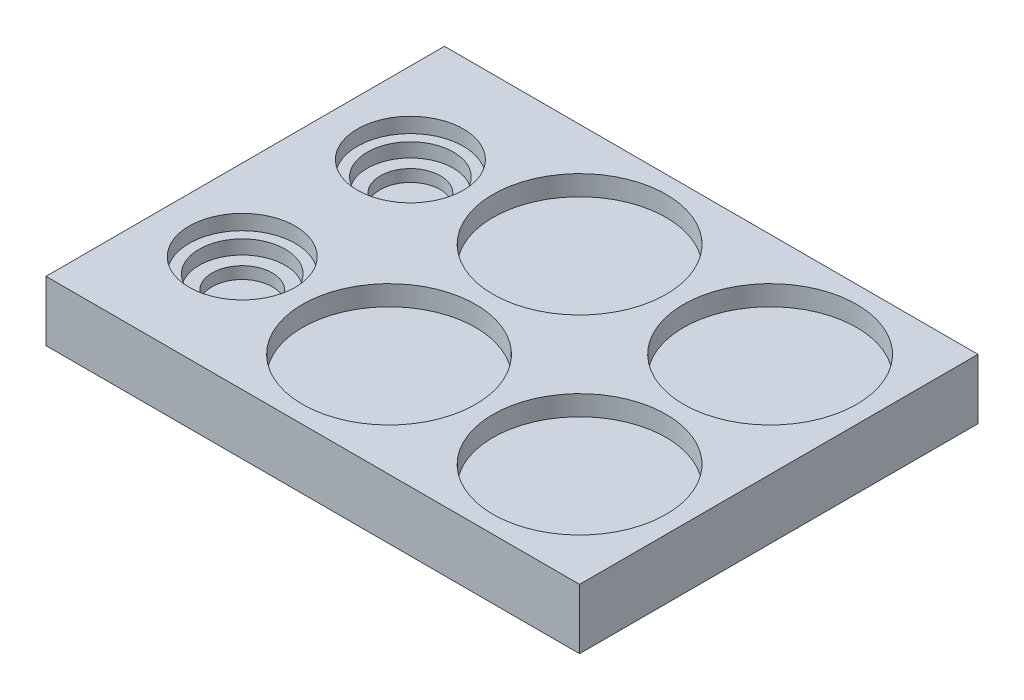
ISO-10303-21;
HEADER;
FILE_DESCRIPTION(('STEP AP214'),'2;1');
FILE_NAME('part.step','',(''),(''),'','','');
FILE_SCHEMA(('AUTOMOTIVE_DESIGN { 1 0 10303 214 1 1 1 1 }'));
ENDSEC;
DATA;
#1=APPLICATION_CONTEXT('core data for automotive mechanical design processes');
#2=APPLICATION_PROTOCOL_DEFINITION('international standard','automotive_design',2000,#1);
#3=PRODUCT_CONTEXT('',#1,'mechanical');
#4=PRODUCT('Part','Part','',(#3));
#5=PRODUCT_RELATED_PRODUCT_CATEGORY('part','',(#4));
#6=PRODUCT_DEFINITION_FORMATION('','',#4);
#7=PRODUCT_DEFINITION_CONTEXT('part definition',#1,'design');
#8=PRODUCT_DEFINITION('design','',#6,#7);
#9=PRODUCT_DEFINITION_SHAPE('','',#8);
#10=(LENGTH_UNIT() NAMED_UNIT(*) SI_UNIT(.MILLI.,.METRE.));
#11=(NAMED_UNIT(*) PLANE_ANGLE_UNIT() SI_UNIT($,.RADIAN.));
#12=(NAMED_UNIT(*) SI_UNIT($,.STERADIAN.) SOLID_ANGLE_UNIT());
#13=UNCERTAINTY_MEASURE_WITH_UNIT(LENGTH_MEASURE(1.E-05),#10,'distance_accuracy_value','');
#14=(GEOMETRIC_REPRESENTATION_CONTEXT(3) GLOBAL_UNCERTAINTY_ASSIGNED_CONTEXT((#13)) GLOBAL_UNIT_ASSIGNED_CONTEXT((#10,
#11,#12)) REPRESENTATION_CONTEXT('',''));
#15=CARTESIAN_POINT('',(0.,0.,0.));
#16=DIRECTION('',(0.,0.,1.));
#17=DIRECTION('',(1.,0.,0.));
#18=AXIS2_PLACEMENT_3D('',#15,#16,#17);
#19=CARTESIAN_POINT('',(0.,-60.,-398.));
#20=DIRECTION('',(-1.,0.,0.));
#21=DIRECTION('',(0.,0.,1.));
#22=AXIS2_PLACEMENT_3D('',#19,#20,#21);
#23=PLANE('',#22);
#24=DIRECTION('',(0.,0.,1.));
#25=VECTOR('',#24,1.);
#26=CARTESIAN_POINT('',(0.,0.,-398.));
#27=LINE('',#26,#25);
#28=CARTESIAN_POINT('',(0.,0.,-398.));
#29=VERTEX_POINT('',#28);
#30=CARTESIAN_POINT('',(0.,0.,0.));
#31=VERTEX_POINT('',#30);
#32=EDGE_CURVE('E100',#29,#31,#27,.T.);
#33=ORIENTED_EDGE('',*,*,#32,.F.);
#34=DIRECTION('',(0.,1.,0.));
#35=VECTOR('',#34,1.);
#36=CARTESIAN_POINT('',(0.,-60.,-398.));
#37=LINE('',#36,#35);
#38=CARTESIAN_POINT('',(0.,-60.,-398.));
#39=VERTEX_POINT('',#38);
#40=EDGE_CURVE('E11',#39,#29,#37,.T.);
#41=ORIENTED_EDGE('',*,*,#40,.F.);
#42=DIRECTION('',(0.,0.,1.));
#43=VECTOR('',#42,1.);
#44=CARTESIAN_POINT('',(0.,-60.,-398.));
#45=LINE('',#44,#43);
#46=CARTESIAN_POINT('',(0.,-60.,0.));
#47=VERTEX_POINT('',#46);
#48=EDGE_CURVE('E93',#39,#47,#45,.T.);
#49=ORIENTED_EDGE('',*,*,#48,.T.);
#50=DIRECTION('',(0.,1.,0.));
#51=VECTOR('',#50,1.);
#52=CARTESIAN_POINT('',(0.,-60.,0.));
#53=LINE('',#52,#51);
#54=EDGE_CURVE('E38',#47,#31,#53,.T.);
#55=ORIENTED_EDGE('',*,*,#54,.T.);
#56=EDGE_LOOP('',(#33,#41,#49,#55));
#57=FACE_BOUND('',#56,.T.);
#58=ADVANCED_FACE('F35',(#57),#23,.T.);
#59=CARTESIAN_POINT('',(0.,-60.,-398.));
#60=DIRECTION('',(0.,0.,-1.));
#61=DIRECTION('',(-1.,0.,0.));
#62=AXIS2_PLACEMENT_3D('',#59,#60,#61);
#63=PLANE('',#62);
#64=DIRECTION('',(-1.,0.,0.));
#65=VECTOR('',#64,1.);
#66=CARTESIAN_POINT('',(0.,0.,-398.));
#67=LINE('',#66,#65);
#68=CARTESIAN_POINT('',(533.,0.,-398.));
#69=VERTEX_POINT('',#68);
#70=EDGE_CURVE('E95',#69,#29,#67,.T.);
#71=ORIENTED_EDGE('',*,*,#70,.F.);
#72=DIRECTION('',(0.,1.,0.));
#73=VECTOR('',#72,1.);
#74=CARTESIAN_POINT('',(533.,-60.,-398.));
#75=LINE('',#74,#73);
#76=CARTESIAN_POINT('',(533.,-60.,-398.));
#77=VERTEX_POINT('',#76);
#78=EDGE_CURVE('E44',#77,#69,#75,.T.);
#79=ORIENTED_EDGE('',*,*,#78,.F.);
#80=DIRECTION('',(-1.,0.,0.));
#81=VECTOR('',#80,1.);
#82=CARTESIAN_POINT('',(0.,-60.,-398.));
#83=LINE('',#82,#81);
#84=EDGE_CURVE('E90',#77,#39,#83,.T.);
#85=ORIENTED_EDGE('',*,*,#84,.T.);
#86=ORIENTED_EDGE('',*,*,#40,.T.);
#87=EDGE_LOOP('',(#71,#79,#85,#86));
#88=FACE_BOUND('',#87,.T.);
#89=ADVANCED_FACE('F111',(#88),#63,.T.);
#90=CARTESIAN_POINT('',(533.,-60.,-398.));
#91=DIRECTION('',(1.,0.,0.));
#92=DIRECTION('',(0.,0.,-1.));
#93=AXIS2_PLACEMENT_3D('',#90,#91,#92);
#94=PLANE('',#93);
#95=DIRECTION('',(0.,0.,-1.));
#96=VECTOR('',#95,1.);
#97=CARTESIAN_POINT('',(533.,0.,-398.));
#98=LINE('',#97,#96);
#99=CARTESIAN_POINT('',(533.,0.,-2.22044604925031E-13));
#100=VERTEX_POINT('',#99);
#101=EDGE_CURVE('E85',#100,#69,#98,.T.);
#102=ORIENTED_EDGE('',*,*,#101,.F.);
#103=DIRECTION('',(0.,1.,0.));
#104=VECTOR('',#103,1.);
#105=CARTESIAN_POINT('',(533.,-60.,-2.22044604925031E-13));
#106=LINE('',#105,#104);
#107=CARTESIAN_POINT('',(533.,-60.,-2.22044604925031E-13));
#108=VERTEX_POINT('',#107);
#109=EDGE_CURVE('E80',#108,#100,#106,.T.);
#110=ORIENTED_EDGE('',*,*,#109,.F.);
#111=DIRECTION('',(0.,0.,-1.));
#112=VECTOR('',#111,1.);
#113=CARTESIAN_POINT('',(533.,-60.,-398.));
#114=LINE('',#113,#112);
#115=EDGE_CURVE('E83',#108,#77,#114,.T.);
#116=ORIENTED_EDGE('',*,*,#115,.T.);
#117=ORIENTED_EDGE('',*,*,#78,.T.);
#118=EDGE_LOOP('',(#102,#110,#116,#117));
#119=FACE_BOUND('',#118,.T.);
#120=ADVANCED_FACE('F82',(#119),#94,.T.);
#121=CARTESIAN_POINT('',(0.,-60.,0.));
#122=DIRECTION('',(0.,0.,1.));
#123=DIRECTION('',(1.,0.,0.));
#124=AXIS2_PLACEMENT_3D('',#121,#122,#123);
#125=PLANE('',#124);
#126=DIRECTION('',(1.,0.,0.));
#127=VECTOR('',#126,1.);
#128=CARTESIAN_POINT('',(0.,0.,0.));
#129=LINE('',#128,#127);
#130=EDGE_CURVE('E103',#31,#100,#129,.T.);
#131=ORIENTED_EDGE('',*,*,#130,.F.);
#132=ORIENTED_EDGE('',*,*,#54,.F.);
#133=DIRECTION('',(1.,0.,0.));
#134=VECTOR('',#133,1.);
#135=CARTESIAN_POINT('',(0.,-60.,0.));
#136=LINE('',#135,#134);
#137=EDGE_CURVE('E89',#47,#108,#136,.T.);
#138=ORIENTED_EDGE('',*,*,#137,.T.);
#139=ORIENTED_EDGE('',*,*,#109,.T.);
#140=EDGE_LOOP('',(#131,#132,#138,#139));
#141=FACE_BOUND('',#140,.T.);
#142=ADVANCED_FACE('F92',(#141),#125,.T.);
#143=CARTESIAN_POINT('',(0.,-60.,0.));
#144=DIRECTION('',(0.,1.,0.));
#145=DIRECTION('',(0.,0.,1.));
#146=AXIS2_PLACEMENT_3D('',#143,#144,#145);
#147=PLANE('',#146);
#148=ORIENTED_EDGE('',*,*,#48,.F.);
#149=ORIENTED_EDGE('',*,*,#84,.F.);
#150=ORIENTED_EDGE('',*,*,#115,.F.);
#151=ORIENTED_EDGE('',*,*,#137,.F.);
#152=EDGE_LOOP('',(#148,#149,#150,#151));
#153=FACE_BOUND('',#152,.T.);
#154=ADVANCED_FACE('F88',(#153),#147,.F.);
#155=CARTESIAN_POINT('',(0.,0.,0.));
#156=DIRECTION('',(0.,1.,0.));
#157=DIRECTION('',(0.,0.,1.));
#158=AXIS2_PLACEMENT_3D('',#155,#156,#157);
#159=PLANE('',#158);
#160=CARTESIAN_POINT('',(81.0000000000002,0.,-283.));
#161=DIRECTION('',(0.,1.,0.));
#162=DIRECTION('',(0.,0.,1.));
#163=AXIS2_PLACEMENT_3D('',#160,#161,#162);
#164=CIRCLE('',#163,53.);
#165=CARTESIAN_POINT('',(81.0000000000002,0.,-230.));
#166=VERTEX_POINT('',#165);
#167=EDGE_CURVE('E242',#166,#166,#164,.T.);
#168=ORIENTED_EDGE('',*,*,#167,.F.);
#169=EDGE_LOOP('',(#168));
#170=FACE_BOUND('',#169,.T.);
#171=CARTESIAN_POINT('',(81.0000000000019,0.,-115.));
#172=DIRECTION('',(0.,1.,0.));
#173=DIRECTION('',(0.,0.,1.));
#174=AXIS2_PLACEMENT_3D('',#171,#172,#173);
#175=CIRCLE('',#174,53.);
#176=CARTESIAN_POINT('',(81.0000000000019,0.,-62.));
#177=VERTEX_POINT('',#176);
#178=EDGE_CURVE('E232',#177,#177,#175,.T.);
#179=ORIENTED_EDGE('',*,*,#178,.F.);
#180=EDGE_LOOP('',(#179));
#181=FACE_BOUND('',#180,.T.);
#182=CARTESIAN_POINT('',(429.166666666666,0.,-294.166666666667));
#183=DIRECTION('',(0.,1.,0.));
#184=DIRECTION('',(0.,0.,1.));
#185=AXIS2_PLACEMENT_3D('',#182,#183,#184);
#186=CIRCLE('',#185,86.5);
#187=CARTESIAN_POINT('',(429.166666666666,0.,-207.666666666667));
#188=VERTEX_POINT('',#187);
#189=EDGE_CURVE('E241',#188,#188,#186,.T.);
#190=ORIENTED_EDGE('',*,*,#189,.F.);
#191=EDGE_LOOP('',(#190));
#192=FACE_BOUND('',#191,.T.);
#193=CARTESIAN_POINT('',(238.833333333333,0.,-294.166666666667));
#194=DIRECTION('',(0.,1.,0.));
#195=DIRECTION('',(0.,0.,1.));
#196=AXIS2_PLACEMENT_3D('',#193,#194,#195);
#197=CIRCLE('',#196,86.5);
#198=CARTESIAN_POINT('',(238.833333333333,0.,-207.666666666667));
#199=VERTEX_POINT('',#198);
#200=EDGE_CURVE('E260',#199,#199,#197,.T.);
#201=ORIENTED_EDGE('',*,*,#200,.F.);
#202=EDGE_LOOP('',(#201));
#203=FACE_BOUND('',#202,.T.);
#204=CARTESIAN_POINT('',(238.833333333333,0.,-103.833333333333));
#205=DIRECTION('',(0.,1.,0.));
#206=DIRECTION('',(0.,0.,1.));
#207=AXIS2_PLACEMENT_3D('',#204,#205,#206);
#208=CIRCLE('',#207,86.5);
#209=CARTESIAN_POINT('',(238.833333333333,0.,-17.3333333333334));
#210=VERTEX_POINT('',#209);
#211=EDGE_CURVE('E254',#210,#210,#208,.T.);
#212=ORIENTED_EDGE('',*,*,#211,.F.);
#213=EDGE_LOOP('',(#212));
#214=FACE_BOUND('',#213,.T.);
#215=CARTESIAN_POINT('',(429.166666666666,0.,-103.833333333333));
#216=DIRECTION('',(0.,1.,0.));
#217=DIRECTION('',(0.,0.,1.));
#218=AXIS2_PLACEMENT_3D('',#215,#216,#217);
#219=CIRCLE('',#218,86.5);
#220=CARTESIAN_POINT('',(429.166666666666,0.,-17.3333333333334));
#221=VERTEX_POINT('',#220);
#222=EDGE_CURVE('E253',#221,#221,#219,.T.);
#223=ORIENTED_EDGE('',*,*,#222,.F.);
#224=EDGE_LOOP('',(#223));
#225=FACE_BOUND('',#224,.T.);
#226=ORIENTED_EDGE('',*,*,#32,.T.);
#227=ORIENTED_EDGE('',*,*,#130,.T.);
#228=ORIENTED_EDGE('',*,*,#101,.T.);
#229=ORIENTED_EDGE('',*,*,#70,.T.);
#230=EDGE_LOOP('',(#226,#227,#228,#229));
#231=FACE_BOUND('',#230,.T.);
#232=ADVANCED_FACE('F110',(#170,#181,#192,#203,#214,#225,#231),#159,.T.);
#233=CARTESIAN_POINT('',(429.166666666666,-20.,-103.833333333333));
#234=DIRECTION('',(0.,1.,0.));
#235=DIRECTION('',(0.,0.,1.));
#236=AXIS2_PLACEMENT_3D('',#233,#234,#235);
#237=CYLINDRICAL_SURFACE('',#236,86.5);
#238=CARTESIAN_POINT('',(429.166666666666,-20.,-103.833333333333));
#239=DIRECTION('',(0.,1.,0.));
#240=DIRECTION('',(0.,0.,1.));
#241=AXIS2_PLACEMENT_3D('',#238,#239,#240);
#242=CIRCLE('',#241,86.5);
#243=CARTESIAN_POINT('',(429.166666666666,-20.,-17.3333333333334));
#244=VERTEX_POINT('',#243);
#245=EDGE_CURVE('E104',#244,#244,#242,.T.);
#246=ORIENTED_EDGE('',*,*,#245,.F.);
#247=EDGE_LOOP('',(#246));
#248=FACE_BOUND('',#247,.T.);
#249=ORIENTED_EDGE('',*,*,#222,.T.);
#250=EDGE_LOOP('',(#249));
#251=FACE_BOUND('',#250,.T.);
#252=ADVANCED_FACE('F128',(#248,#251),#237,.F.);
#253=CARTESIAN_POINT('',(429.166666666666,-20.,-103.833333333333));
#254=DIRECTION('',(0.,1.,0.));
#255=DIRECTION('',(0.,0.,1.));
#256=AXIS2_PLACEMENT_3D('',#253,#254,#255);
#257=PLANE('',#256);
#258=ORIENTED_EDGE('',*,*,#245,.T.);
#259=EDGE_LOOP('',(#258));
#260=FACE_BOUND('',#259,.T.);
#261=ADVANCED_FACE('F133',(#260),#257,.T.);
#262=CARTESIAN_POINT('',(238.833333333333,-20.,-103.833333333333));
#263=DIRECTION('',(0.,1.,0.));
#264=DIRECTION('',(0.,0.,1.));
#265=AXIS2_PLACEMENT_3D('',#262,#263,#264);
#266=CYLINDRICAL_SURFACE('',#265,86.5);
#267=CARTESIAN_POINT('',(238.833333333333,-20.,-103.833333333333));
#268=DIRECTION('',(0.,1.,0.));
#269=DIRECTION('',(0.,0.,1.));
#270=AXIS2_PLACEMENT_3D('',#267,#268,#269);
#271=CIRCLE('',#270,86.5);
#272=CARTESIAN_POINT('',(238.833333333333,-20.,-17.3333333333334));
#273=VERTEX_POINT('',#272);
#274=EDGE_CURVE('E250',#273,#273,#271,.T.);
#275=ORIENTED_EDGE('',*,*,#274,.F.);
#276=EDGE_LOOP('',(#275));
#277=FACE_BOUND('',#276,.T.);
#278=ORIENTED_EDGE('',*,*,#211,.T.);
#279=EDGE_LOOP('',(#278));
#280=FACE_BOUND('',#279,.T.);
#281=ADVANCED_FACE('F137',(#277,#280),#266,.F.);
#282=CARTESIAN_POINT('',(238.833333333333,-20.,-103.833333333333));
#283=DIRECTION('',(0.,1.,0.));
#284=DIRECTION('',(0.,0.,1.));
#285=AXIS2_PLACEMENT_3D('',#282,#283,#284);
#286=PLANE('',#285);
#287=ORIENTED_EDGE('',*,*,#274,.T.);
#288=EDGE_LOOP('',(#287));
#289=FACE_BOUND('',#288,.T.);
#290=ADVANCED_FACE('F152',(#289),#286,.T.);
#291=CARTESIAN_POINT('',(238.833333333333,-20.,-294.166666666667));
#292=DIRECTION('',(0.,1.,0.));
#293=DIRECTION('',(0.,0.,1.));
#294=AXIS2_PLACEMENT_3D('',#291,#292,#293);
#295=CYLINDRICAL_SURFACE('',#294,86.5);
#296=CARTESIAN_POINT('',(238.833333333333,-20.,-294.166666666667));
#297=DIRECTION('',(0.,1.,0.));
#298=DIRECTION('',(0.,0.,1.));
#299=AXIS2_PLACEMENT_3D('',#296,#297,#298);
#300=CIRCLE('',#299,86.5);
#301=CARTESIAN_POINT('',(238.833333333333,-20.,-207.666666666667));
#302=VERTEX_POINT('',#301);
#303=EDGE_CURVE('E257',#302,#302,#300,.T.);
#304=ORIENTED_EDGE('',*,*,#303,.F.);
#305=EDGE_LOOP('',(#304));
#306=FACE_BOUND('',#305,.T.);
#307=ORIENTED_EDGE('',*,*,#200,.T.);
#308=EDGE_LOOP('',(#307));
#309=FACE_BOUND('',#308,.T.);
#310=ADVANCED_FACE('F149',(#306,#309),#295,.F.);
#311=CARTESIAN_POINT('',(238.833333333333,-20.,-294.166666666667));
#312=DIRECTION('',(0.,1.,0.));
#313=DIRECTION('',(0.,0.,1.));
#314=AXIS2_PLACEMENT_3D('',#311,#312,#313);
#315=PLANE('',#314);
#316=ORIENTED_EDGE('',*,*,#303,.T.);
#317=EDGE_LOOP('',(#316));
#318=FACE_BOUND('',#317,.T.);
#319=ADVANCED_FACE('F143',(#318),#315,.T.);
#320=CARTESIAN_POINT('',(429.166666666666,-20.,-294.166666666667));
#321=DIRECTION('',(0.,1.,0.));
#322=DIRECTION('',(0.,0.,1.));
#323=AXIS2_PLACEMENT_3D('',#320,#321,#322);
#324=CYLINDRICAL_SURFACE('',#323,86.5);
#325=CARTESIAN_POINT('',(429.166666666666,-20.,-294.166666666667));
#326=DIRECTION('',(0.,1.,0.));
#327=DIRECTION('',(0.,0.,1.));
#328=AXIS2_PLACEMENT_3D('',#325,#326,#327);
#329=CIRCLE('',#328,86.5);
#330=CARTESIAN_POINT('',(429.166666666666,-20.,-207.666666666667));
#331=VERTEX_POINT('',#330);
#332=EDGE_CURVE('E263',#331,#331,#329,.T.);
#333=ORIENTED_EDGE('',*,*,#332,.F.);
#334=EDGE_LOOP('',(#333));
#335=FACE_BOUND('',#334,.T.);
#336=ORIENTED_EDGE('',*,*,#189,.T.);
#337=EDGE_LOOP('',(#336));
#338=FACE_BOUND('',#337,.T.);
#339=ADVANCED_FACE('F139',(#335,#338),#324,.F.);
#340=CARTESIAN_POINT('',(429.166666666666,-20.,-294.166666666667));
#341=DIRECTION('',(0.,1.,0.));
#342=DIRECTION('',(0.,0.,1.));
#343=AXIS2_PLACEMENT_3D('',#340,#341,#342);
#344=PLANE('',#343);
#345=ORIENTED_EDGE('',*,*,#332,.T.);
#346=EDGE_LOOP('',(#345));
#347=FACE_BOUND('',#346,.T.);
#348=ADVANCED_FACE('F142',(#347),#344,.T.);
#349=CARTESIAN_POINT('',(81.0000000000019,-15.,-115.));
#350=DIRECTION('',(0.,1.,0.));
#351=DIRECTION('',(0.,0.,1.));
#352=AXIS2_PLACEMENT_3D('',#349,#350,#351);
#353=CYLINDRICAL_SURFACE('',#352,53.);
#354=CARTESIAN_POINT('',(81.0000000000019,-15.,-115.));
#355=DIRECTION('',(0.,1.,0.));
#356=DIRECTION('',(0.,0.,1.));
#357=AXIS2_PLACEMENT_3D('',#354,#355,#356);
#358=CIRCLE('',#357,53.);
#359=CARTESIAN_POINT('',(81.0000000000019,-15.,-62.));
#360=VERTEX_POINT('',#359);
#361=EDGE_CURVE('E245',#360,#360,#358,.T.);
#362=ORIENTED_EDGE('',*,*,#361,.F.);
#363=EDGE_LOOP('',(#362));
#364=FACE_BOUND('',#363,.T.);
#365=ORIENTED_EDGE('',*,*,#178,.T.);
#366=EDGE_LOOP('',(#365));
#367=FACE_BOUND('',#366,.T.);
#368=ADVANCED_FACE('F147',(#364,#367),#353,.F.);
#369=CARTESIAN_POINT('',(81.0000000000019,-15.,-115.));
#370=DIRECTION('',(0.,1.,0.));
#371=DIRECTION('',(0.,0.,1.));
#372=AXIS2_PLACEMENT_3D('',#369,#370,#371);
#373=PLANE('',#372);
#374=CARTESIAN_POINT('',(81.0000000000019,-15.,-115.));
#375=DIRECTION('',(0.,1.,0.));
#376=DIRECTION('',(0.,0.,1.));
#377=AXIS2_PLACEMENT_3D('',#374,#375,#376);
#378=CIRCLE('',#377,43.);
#379=CARTESIAN_POINT('',(81.0000000000019,-15.,-72.0000000000001));
#380=VERTEX_POINT('',#379);
#381=EDGE_CURVE('E214',#380,#380,#378,.T.);
#382=ORIENTED_EDGE('',*,*,#381,.F.);
#383=EDGE_LOOP('',(#382));
#384=FACE_BOUND('',#383,.T.);
#385=ORIENTED_EDGE('',*,*,#361,.T.);
#386=EDGE_LOOP('',(#385));
#387=FACE_BOUND('',#386,.T.);
#388=ADVANCED_FACE('F165',(#384,#387),#373,.T.);
#389=CARTESIAN_POINT('',(81.0000000000002,-15.,-283.));
#390=DIRECTION('',(0.,1.,0.));
#391=DIRECTION('',(0.,0.,1.));
#392=AXIS2_PLACEMENT_3D('',#389,#390,#391);
#393=CYLINDRICAL_SURFACE('',#392,53.);
#394=CARTESIAN_POINT('',(81.0000000000002,-15.,-283.));
#395=DIRECTION('',(0.,1.,0.));
#396=DIRECTION('',(0.,0.,1.));
#397=AXIS2_PLACEMENT_3D('',#394,#395,#396);
#398=CIRCLE('',#397,53.);
#399=CARTESIAN_POINT('',(81.0000000000002,-15.,-230.));
#400=VERTEX_POINT('',#399);
#401=EDGE_CURVE('E238',#400,#400,#398,.T.);
#402=ORIENTED_EDGE('',*,*,#401,.F.);
#403=EDGE_LOOP('',(#402));
#404=FACE_BOUND('',#403,.T.);
#405=ORIENTED_EDGE('',*,*,#167,.T.);
#406=EDGE_LOOP('',(#405));
#407=FACE_BOUND('',#406,.T.);
#408=ADVANCED_FACE('F169',(#404,#407),#393,.F.);
#409=CARTESIAN_POINT('',(81.0000000000002,-15.,-283.));
#410=DIRECTION('',(0.,1.,0.));
#411=DIRECTION('',(0.,0.,1.));
#412=AXIS2_PLACEMENT_3D('',#409,#410,#411);
#413=PLANE('',#412);
#414=CARTESIAN_POINT('',(81.0000000000002,-15.,-283.));
#415=DIRECTION('',(0.,1.,0.));
#416=DIRECTION('',(0.,0.,1.));
#417=AXIS2_PLACEMENT_3D('',#414,#415,#416);
#418=CIRCLE('',#417,43.);
#419=CARTESIAN_POINT('',(81.0000000000002,-15.,-240.));
#420=VERTEX_POINT('',#419);
#421=EDGE_CURVE('E233',#420,#420,#418,.T.);
#422=ORIENTED_EDGE('',*,*,#421,.F.);
#423=EDGE_LOOP('',(#422));
#424=FACE_BOUND('',#423,.T.);
#425=ORIENTED_EDGE('',*,*,#401,.T.);
#426=EDGE_LOOP('',(#425));
#427=FACE_BOUND('',#426,.T.);
#428=ADVANCED_FACE('F173',(#424,#427),#413,.T.);
#429=CARTESIAN_POINT('',(81.0000000000002,-29.,-283.));
#430=DIRECTION('',(0.,1.,0.));
#431=DIRECTION('',(0.,0.,1.));
#432=AXIS2_PLACEMENT_3D('',#429,#430,#431);
#433=CYLINDRICAL_SURFACE('',#432,43.);
#434=CARTESIAN_POINT('',(81.0000000000002,-29.,-283.));
#435=DIRECTION('',(0.,1.,0.));
#436=DIRECTION('',(0.,0.,1.));
#437=AXIS2_PLACEMENT_3D('',#434,#435,#436);
#438=CIRCLE('',#437,43.);
#439=CARTESIAN_POINT('',(81.0000000000002,-29.,-240.));
#440=VERTEX_POINT('',#439);
#441=EDGE_CURVE('E229',#440,#440,#438,.T.);
#442=ORIENTED_EDGE('',*,*,#441,.F.);
#443=EDGE_LOOP('',(#442));
#444=FACE_BOUND('',#443,.T.);
#445=ORIENTED_EDGE('',*,*,#421,.T.);
#446=EDGE_LOOP('',(#445));
#447=FACE_BOUND('',#446,.T.);
#448=ADVANCED_FACE('F177',(#444,#447),#433,.F.);
#449=CARTESIAN_POINT('',(81.0000000000002,-29.,-283.));
#450=DIRECTION('',(0.,1.,0.));
#451=DIRECTION('',(0.,0.,1.));
#452=AXIS2_PLACEMENT_3D('',#449,#450,#451);
#453=PLANE('',#452);
#454=CARTESIAN_POINT('',(81.0000000000002,-29.,-283.));
#455=DIRECTION('',(0.,1.,0.));
#456=DIRECTION('',(0.,0.,1.));
#457=AXIS2_PLACEMENT_3D('',#454,#455,#456);
#458=CIRCLE('',#457,30.);
#459=CARTESIAN_POINT('',(81.0000000000002,-29.,-253.));
#460=VERTEX_POINT('',#459);
#461=EDGE_CURVE('E215',#460,#460,#458,.T.);
#462=ORIENTED_EDGE('',*,*,#461,.F.);
#463=EDGE_LOOP('',(#462));
#464=FACE_BOUND('',#463,.T.);
#465=ORIENTED_EDGE('',*,*,#441,.T.);
#466=EDGE_LOOP('',(#465));
#467=FACE_BOUND('',#466,.T.);
#468=ADVANCED_FACE('F183',(#464,#467),#453,.T.);
#469=CARTESIAN_POINT('',(81.0000000000019,-29.,-115.));
#470=DIRECTION('',(0.,1.,0.));
#471=DIRECTION('',(0.,0.,1.));
#472=AXIS2_PLACEMENT_3D('',#469,#470,#471);
#473=CYLINDRICAL_SURFACE('',#472,43.);
#474=CARTESIAN_POINT('',(81.0000000000019,-29.,-115.));
#475=DIRECTION('',(0.,1.,0.));
#476=DIRECTION('',(0.,0.,1.));
#477=AXIS2_PLACEMENT_3D('',#474,#475,#476);
#478=CIRCLE('',#477,43.);
#479=CARTESIAN_POINT('',(81.0000000000019,-29.,-72.0000000000001));
#480=VERTEX_POINT('',#479);
#481=EDGE_CURVE('E218',#480,#480,#478,.T.);
#482=ORIENTED_EDGE('',*,*,#481,.F.);
#483=EDGE_LOOP('',(#482));
#484=FACE_BOUND('',#483,.T.);
#485=ORIENTED_EDGE('',*,*,#381,.T.);
#486=EDGE_LOOP('',(#485));
#487=FACE_BOUND('',#486,.T.);
#488=ADVANCED_FACE('F179',(#484,#487),#473,.F.);
#489=CARTESIAN_POINT('',(81.0000000000019,-29.,-115.));
#490=DIRECTION('',(0.,1.,0.));
#491=DIRECTION('',(0.,0.,1.));
#492=AXIS2_PLACEMENT_3D('',#489,#490,#491);
#493=PLANE('',#492);
#494=CARTESIAN_POINT('',(81.0000000000019,-29.,-115.));
#495=DIRECTION('',(0.,1.,0.));
#496=DIRECTION('',(0.,0.,1.));
#497=AXIS2_PLACEMENT_3D('',#494,#495,#496);
#498=CIRCLE('',#497,30.);
#499=CARTESIAN_POINT('',(81.0000000000019,-29.,-85.));
#500=VERTEX_POINT('',#499);
#501=EDGE_CURVE('E226',#500,#500,#498,.T.);
#502=ORIENTED_EDGE('',*,*,#501,.F.);
#503=EDGE_LOOP('',(#502));
#504=FACE_BOUND('',#503,.T.);
#505=ORIENTED_EDGE('',*,*,#481,.T.);
#506=EDGE_LOOP('',(#505));
#507=FACE_BOUND('',#506,.T.);
#508=ADVANCED_FACE('F182',(#504,#507),#493,.T.);
#509=CARTESIAN_POINT('',(81.0000000000019,-41.,-115.));
#510=DIRECTION('',(0.,1.,0.));
#511=DIRECTION('',(0.,0.,1.));
#512=AXIS2_PLACEMENT_3D('',#509,#510,#511);
#513=CYLINDRICAL_SURFACE('',#512,30.);
#514=CARTESIAN_POINT('',(81.0000000000019,-41.,-115.));
#515=DIRECTION('',(0.,1.,0.));
#516=DIRECTION('',(0.,0.,1.));
#517=AXIS2_PLACEMENT_3D('',#514,#515,#516);
#518=CIRCLE('',#517,30.);
#519=CARTESIAN_POINT('',(81.0000000000019,-41.,-85.));
#520=VERTEX_POINT('',#519);
#521=EDGE_CURVE('E221',#520,#520,#518,.T.);
#522=ORIENTED_EDGE('',*,*,#521,.F.);
#523=EDGE_LOOP('',(#522));
#524=FACE_BOUND('',#523,.T.);
#525=ORIENTED_EDGE('',*,*,#501,.T.);
#526=EDGE_LOOP('',(#525));
#527=FACE_BOUND('',#526,.T.);
#528=ADVANCED_FACE('F187',(#524,#527),#513,.F.);
#529=CARTESIAN_POINT('',(81.0000000000019,-41.,-115.));
#530=DIRECTION('',(0.,1.,0.));
#531=DIRECTION('',(0.,0.,1.));
#532=AXIS2_PLACEMENT_3D('',#529,#530,#531);
#533=PLANE('',#532);
#534=ORIENTED_EDGE('',*,*,#521,.T.);
#535=EDGE_LOOP('',(#534));
#536=FACE_BOUND('',#535,.T.);
#537=ADVANCED_FACE('F197',(#536),#533,.T.);
#538=CARTESIAN_POINT('',(81.0000000000002,-41.,-283.));
#539=DIRECTION('',(0.,1.,0.));
#540=DIRECTION('',(0.,0.,1.));
#541=AXIS2_PLACEMENT_3D('',#538,#539,#540);
#542=CYLINDRICAL_SURFACE('',#541,30.);
#543=CARTESIAN_POINT('',(81.0000000000002,-41.,-283.));
#544=DIRECTION('',(0.,1.,0.));
#545=DIRECTION('',(0.,0.,1.));
#546=AXIS2_PLACEMENT_3D('',#543,#544,#545);
#547=CIRCLE('',#546,30.);
#548=CARTESIAN_POINT('',(81.0000000000002,-41.,-253.));
#549=VERTEX_POINT('',#548);
#550=EDGE_CURVE('E213',#549,#549,#547,.T.);
#551=ORIENTED_EDGE('',*,*,#550,.F.);
#552=EDGE_LOOP('',(#551));
#553=FACE_BOUND('',#552,.T.);
#554=ORIENTED_EDGE('',*,*,#461,.T.);
#555=EDGE_LOOP('',(#554));
#556=FACE_BOUND('',#555,.T.);
#557=ADVANCED_FACE('F201',(#553,#556),#542,.F.);
#558=CARTESIAN_POINT('',(81.0000000000002,-41.,-283.));
#559=DIRECTION('',(0.,1.,0.));
#560=DIRECTION('',(0.,0.,1.));
#561=AXIS2_PLACEMENT_3D('',#558,#559,#560);
#562=PLANE('',#561);
#563=ORIENTED_EDGE('',*,*,#550,.T.);
#564=EDGE_LOOP('',(#563));
#565=FACE_BOUND('',#564,.T.);
#566=ADVANCED_FACE('F205',(#565),#562,.T.);
#567=CLOSED_SHELL('',(#58,#89,#120,#142,#154,#232,#252,#261,#281,#290,#310,#319,#339,#348,#368,
#388,#408,#428,#448,#468,#488,#508,#528,#537,#557,#566));
#568=MANIFOLD_SOLID_BREP('B2',#567);
#569=ADVANCED_BREP_SHAPE_REPRESENTATION('',(#18,#568),#14);
#570=SHAPE_DEFINITION_REPRESENTATION(#9,#569);
ENDSEC;
END-ISO-10303-21;
